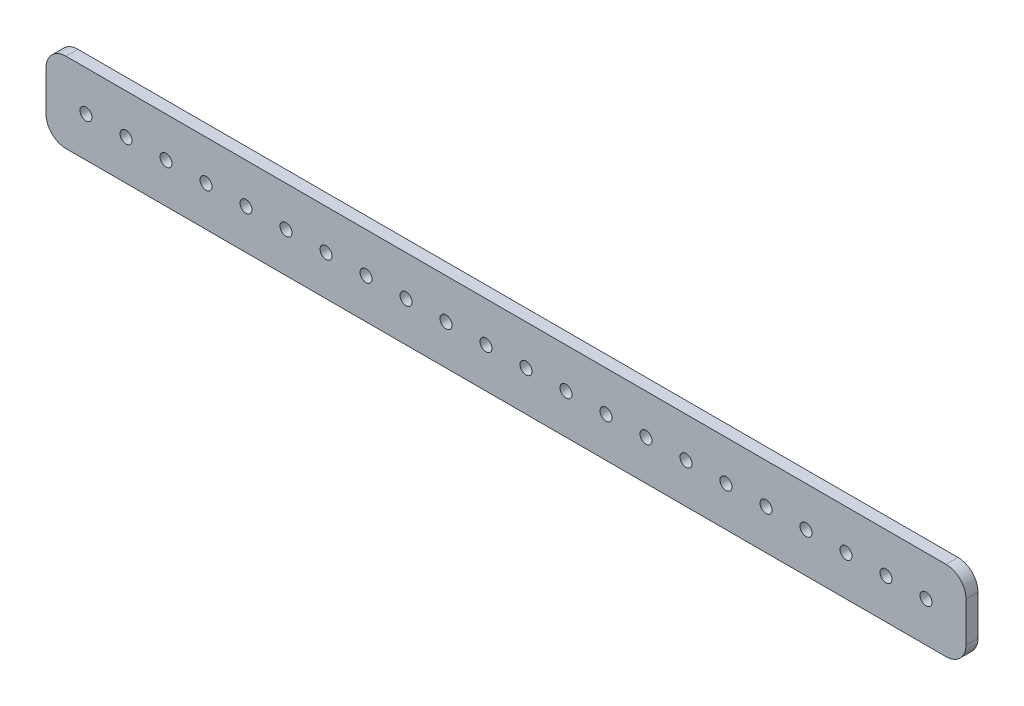
ISO-10303-21;
HEADER;
FILE_DESCRIPTION(('STEP AP214'),'2;1');
FILE_NAME('part.step','',(''),(''),'','','');
FILE_SCHEMA(('AUTOMOTIVE_DESIGN { 1 0 10303 214 1 1 1 1 }'));
ENDSEC;
DATA;
#1=APPLICATION_CONTEXT('core data for automotive mechanical design processes');
#2=APPLICATION_PROTOCOL_DEFINITION('international standard','automotive_design',2000,#1);
#3=PRODUCT_CONTEXT('',#1,'mechanical');
#4=PRODUCT('Part','Part','',(#3));
#5=PRODUCT_RELATED_PRODUCT_CATEGORY('part','',(#4));
#6=PRODUCT_DEFINITION_FORMATION('','',#4);
#7=PRODUCT_DEFINITION_CONTEXT('part definition',#1,'design');
#8=PRODUCT_DEFINITION('design','',#6,#7);
#9=PRODUCT_DEFINITION_SHAPE('','',#8);
#10=(LENGTH_UNIT() NAMED_UNIT(*) SI_UNIT(.MILLI.,.METRE.));
#11=(NAMED_UNIT(*) PLANE_ANGLE_UNIT() SI_UNIT($,.RADIAN.));
#12=(NAMED_UNIT(*) SI_UNIT($,.STERADIAN.) SOLID_ANGLE_UNIT());
#13=UNCERTAINTY_MEASURE_WITH_UNIT(LENGTH_MEASURE(1.E-05),#10,'distance_accuracy_value','');
#14=(GEOMETRIC_REPRESENTATION_CONTEXT(3) GLOBAL_UNCERTAINTY_ASSIGNED_CONTEXT((#13)) GLOBAL_UNIT_ASSIGNED_CONTEXT((#10,
#11,#12)) REPRESENTATION_CONTEXT('',''));
#15=CARTESIAN_POINT('',(0.,0.,0.));
#16=DIRECTION('',(0.,0.,1.));
#17=DIRECTION('',(1.,0.,0.));
#18=AXIS2_PLACEMENT_3D('',#15,#16,#17);
#19=CARTESIAN_POINT('',(110.,-5.,3.));
#20=DIRECTION('',(0.,0.,-1.));
#21=DIRECTION('',(-1.,0.,0.));
#22=AXIS2_PLACEMENT_3D('',#19,#20,#21);
#23=PLANE('',#22);
#24=CARTESIAN_POINT('',(110.,-5.,3.));
#25=DIRECTION('',(0.,0.,1.));
#26=DIRECTION('',(-1.,0.,0.));
#27=AXIS2_PLACEMENT_3D('',#24,#25,#26);
#28=CIRCLE('',#27,5.);
#29=CARTESIAN_POINT('',(110.,-10.,3.));
#30=VERTEX_POINT('',#29);
#31=CARTESIAN_POINT('',(115.,-5.,3.));
#32=VERTEX_POINT('',#31);
#33=EDGE_CURVE('E148',#30,#32,#28,.T.);
#34=ORIENTED_EDGE('',*,*,#33,.T.);
#35=DIRECTION('',(0.,1.,0.));
#36=VECTOR('',#35,1.);
#37=CARTESIAN_POINT('',(115.,5.,3.));
#38=LINE('',#37,#36);
#39=CARTESIAN_POINT('',(115.,5.,3.));
#40=VERTEX_POINT('',#39);
#41=EDGE_CURVE('E96',#32,#40,#38,.T.);
#42=ORIENTED_EDGE('',*,*,#41,.T.);
#43=CARTESIAN_POINT('',(110.,5.,3.));
#44=DIRECTION('',(0.,0.,1.));
#45=DIRECTION('',(1.,0.,0.));
#46=AXIS2_PLACEMENT_3D('',#43,#44,#45);
#47=CIRCLE('',#46,5.);
#48=CARTESIAN_POINT('',(110.,10.,3.));
#49=VERTEX_POINT('',#48);
#50=EDGE_CURVE('E163',#40,#49,#47,.T.);
#51=ORIENTED_EDGE('',*,*,#50,.T.);
#52=DIRECTION('',(-1.,0.,0.));
#53=VECTOR('',#52,1.);
#54=CARTESIAN_POINT('',(-110.,10.,3.));
#55=LINE('',#54,#53);
#56=CARTESIAN_POINT('',(-110.,10.,3.));
#57=VERTEX_POINT('',#56);
#58=EDGE_CURVE('E176',#49,#57,#55,.T.);
#59=ORIENTED_EDGE('',*,*,#58,.T.);
#60=CARTESIAN_POINT('',(-110.,5.,3.));
#61=DIRECTION('',(0.,0.,1.));
#62=DIRECTION('',(1.,0.,0.));
#63=AXIS2_PLACEMENT_3D('',#60,#61,#62);
#64=CIRCLE('',#63,5.);
#65=CARTESIAN_POINT('',(-115.,5.,3.));
#66=VERTEX_POINT('',#65);
#67=EDGE_CURVE('E115',#57,#66,#64,.T.);
#68=ORIENTED_EDGE('',*,*,#67,.T.);
#69=DIRECTION('',(0.,-1.,0.));
#70=VECTOR('',#69,1.);
#71=CARTESIAN_POINT('',(-115.,5.,3.));
#72=LINE('',#71,#70);
#73=CARTESIAN_POINT('',(-115.,-5.,3.));
#74=VERTEX_POINT('',#73);
#75=EDGE_CURVE('E109',#66,#74,#72,.T.);
#76=ORIENTED_EDGE('',*,*,#75,.T.);
#77=CARTESIAN_POINT('',(-110.,-5.,3.));
#78=DIRECTION('',(0.,0.,1.));
#79=DIRECTION('',(-1.,0.,0.));
#80=AXIS2_PLACEMENT_3D('',#77,#78,#79);
#81=CIRCLE('',#80,5.);
#82=CARTESIAN_POINT('',(-110.,-10.,3.));
#83=VERTEX_POINT('',#82);
#84=EDGE_CURVE('E113',#74,#83,#81,.T.);
#85=ORIENTED_EDGE('',*,*,#84,.T.);
#86=DIRECTION('',(1.,0.,0.));
#87=VECTOR('',#86,1.);
#88=CARTESIAN_POINT('',(-110.,-10.,3.));
#89=LINE('',#88,#87);
#90=EDGE_CURVE('E53',#83,#30,#89,.T.);
#91=ORIENTED_EDGE('',*,*,#90,.T.);
#92=EDGE_LOOP('',(#34,#42,#51,#59,#68,#76,#85,#91));
#93=FACE_BOUND('',#92,.T.);
#94=CARTESIAN_POINT('',(105.,0.,3.));
#95=DIRECTION('',(0.,0.,1.));
#96=DIRECTION('',(1.,0.,0.));
#97=AXIS2_PLACEMENT_3D('',#94,#95,#96);
#98=CIRCLE('',#97,1.50000000000003);
#99=CARTESIAN_POINT('',(106.5,0.,3.));
#100=VERTEX_POINT('',#99);
#101=EDGE_CURVE('E137',#100,#100,#98,.T.);
#102=ORIENTED_EDGE('',*,*,#101,.F.);
#103=EDGE_LOOP('',(#102));
#104=FACE_BOUND('',#103,.T.);
#105=CARTESIAN_POINT('',(-105.,0.,3.));
#106=DIRECTION('',(0.,0.,1.));
#107=DIRECTION('',(1.,0.,0.));
#108=AXIS2_PLACEMENT_3D('',#105,#106,#107);
#109=CIRCLE('',#108,1.50000000000003);
#110=CARTESIAN_POINT('',(-103.5,0.,3.));
#111=VERTEX_POINT('',#110);
#112=EDGE_CURVE('E185',#111,#111,#109,.T.);
#113=ORIENTED_EDGE('',*,*,#112,.F.);
#114=EDGE_LOOP('',(#113));
#115=FACE_BOUND('',#114,.T.);
#116=CARTESIAN_POINT('',(-95.,0.,3.));
#117=DIRECTION('',(0.,0.,1.));
#118=DIRECTION('',(1.,0.,0.));
#119=AXIS2_PLACEMENT_3D('',#116,#117,#118);
#120=CIRCLE('',#119,1.50000000000003);
#121=CARTESIAN_POINT('',(-93.5,0.,3.));
#122=VERTEX_POINT('',#121);
#123=EDGE_CURVE('E191',#122,#122,#120,.T.);
#124=ORIENTED_EDGE('',*,*,#123,.F.);
#125=EDGE_LOOP('',(#124));
#126=FACE_BOUND('',#125,.T.);
#127=CARTESIAN_POINT('',(-85.,0.,3.));
#128=DIRECTION('',(0.,0.,1.));
#129=DIRECTION('',(1.,0.,0.));
#130=AXIS2_PLACEMENT_3D('',#127,#128,#129);
#131=CIRCLE('',#130,1.5);
#132=CARTESIAN_POINT('',(-83.5,0.,3.));
#133=VERTEX_POINT('',#132);
#134=EDGE_CURVE('E197',#133,#133,#131,.T.);
#135=ORIENTED_EDGE('',*,*,#134,.F.);
#136=EDGE_LOOP('',(#135));
#137=FACE_BOUND('',#136,.T.);
#138=CARTESIAN_POINT('',(-75.,0.,3.));
#139=DIRECTION('',(0.,0.,1.));
#140=DIRECTION('',(1.,0.,0.));
#141=AXIS2_PLACEMENT_3D('',#138,#139,#140);
#142=CIRCLE('',#141,1.49999999999997);
#143=CARTESIAN_POINT('',(-73.5,0.,3.));
#144=VERTEX_POINT('',#143);
#145=EDGE_CURVE('E203',#144,#144,#142,.T.);
#146=ORIENTED_EDGE('',*,*,#145,.F.);
#147=EDGE_LOOP('',(#146));
#148=FACE_BOUND('',#147,.T.);
#149=CARTESIAN_POINT('',(-65.,0.,3.));
#150=DIRECTION('',(0.,0.,1.));
#151=DIRECTION('',(1.,0.,0.));
#152=AXIS2_PLACEMENT_3D('',#149,#150,#151);
#153=CIRCLE('',#152,1.5);
#154=CARTESIAN_POINT('',(-63.5,0.,3.));
#155=VERTEX_POINT('',#154);
#156=EDGE_CURVE('E209',#155,#155,#153,.T.);
#157=ORIENTED_EDGE('',*,*,#156,.F.);
#158=EDGE_LOOP('',(#157));
#159=FACE_BOUND('',#158,.T.);
#160=CARTESIAN_POINT('',(-55.,0.,3.));
#161=DIRECTION('',(0.,0.,1.));
#162=DIRECTION('',(1.,0.,0.));
#163=AXIS2_PLACEMENT_3D('',#160,#161,#162);
#164=CIRCLE('',#163,1.50000000000001);
#165=CARTESIAN_POINT('',(-53.5,0.,3.));
#166=VERTEX_POINT('',#165);
#167=EDGE_CURVE('E215',#166,#166,#164,.T.);
#168=ORIENTED_EDGE('',*,*,#167,.F.);
#169=EDGE_LOOP('',(#168));
#170=FACE_BOUND('',#169,.T.);
#171=CARTESIAN_POINT('',(-45.,0.,3.));
#172=DIRECTION('',(0.,0.,1.));
#173=DIRECTION('',(1.,0.,0.));
#174=AXIS2_PLACEMENT_3D('',#171,#172,#173);
#175=CIRCLE('',#174,1.5);
#176=CARTESIAN_POINT('',(-43.5,0.,3.));
#177=VERTEX_POINT('',#176);
#178=EDGE_CURVE('E221',#177,#177,#175,.T.);
#179=ORIENTED_EDGE('',*,*,#178,.F.);
#180=EDGE_LOOP('',(#179));
#181=FACE_BOUND('',#180,.T.);
#182=CARTESIAN_POINT('',(-35.,0.,3.));
#183=DIRECTION('',(0.,0.,1.));
#184=DIRECTION('',(1.,0.,0.));
#185=AXIS2_PLACEMENT_3D('',#182,#183,#184);
#186=CIRCLE('',#185,1.5);
#187=CARTESIAN_POINT('',(-33.5,0.,3.));
#188=VERTEX_POINT('',#187);
#189=EDGE_CURVE('E227',#188,#188,#186,.T.);
#190=ORIENTED_EDGE('',*,*,#189,.F.);
#191=EDGE_LOOP('',(#190));
#192=FACE_BOUND('',#191,.T.);
#193=CARTESIAN_POINT('',(-25.,0.,3.));
#194=DIRECTION('',(0.,0.,1.));
#195=DIRECTION('',(1.,0.,0.));
#196=AXIS2_PLACEMENT_3D('',#193,#194,#195);
#197=CIRCLE('',#196,1.5);
#198=CARTESIAN_POINT('',(-23.5,0.,3.));
#199=VERTEX_POINT('',#198);
#200=EDGE_CURVE('E233',#199,#199,#197,.T.);
#201=ORIENTED_EDGE('',*,*,#200,.F.);
#202=EDGE_LOOP('',(#201));
#203=FACE_BOUND('',#202,.T.);
#204=CARTESIAN_POINT('',(-15.,0.,3.));
#205=DIRECTION('',(0.,0.,1.));
#206=DIRECTION('',(1.,0.,0.));
#207=AXIS2_PLACEMENT_3D('',#204,#205,#206);
#208=CIRCLE('',#207,1.5);
#209=CARTESIAN_POINT('',(-13.5,0.,3.));
#210=VERTEX_POINT('',#209);
#211=EDGE_CURVE('E239',#210,#210,#208,.T.);
#212=ORIENTED_EDGE('',*,*,#211,.F.);
#213=EDGE_LOOP('',(#212));
#214=FACE_BOUND('',#213,.T.);
#215=CARTESIAN_POINT('',(-5.00000000000003,0.,3.));
#216=DIRECTION('',(0.,0.,1.));
#217=DIRECTION('',(1.,0.,0.));
#218=AXIS2_PLACEMENT_3D('',#215,#216,#217);
#219=CIRCLE('',#218,1.5);
#220=CARTESIAN_POINT('',(-3.50000000000003,0.,3.));
#221=VERTEX_POINT('',#220);
#222=EDGE_CURVE('E245',#221,#221,#219,.T.);
#223=ORIENTED_EDGE('',*,*,#222,.F.);
#224=EDGE_LOOP('',(#223));
#225=FACE_BOUND('',#224,.T.);
#226=CARTESIAN_POINT('',(25.,0.,3.));
#227=DIRECTION('',(0.,0.,1.));
#228=DIRECTION('',(1.,0.,0.));
#229=AXIS2_PLACEMENT_3D('',#226,#227,#228);
#230=CIRCLE('',#229,1.5);
#231=CARTESIAN_POINT('',(26.5,0.,3.));
#232=VERTEX_POINT('',#231);
#233=EDGE_CURVE('E251',#232,#232,#230,.T.);
#234=ORIENTED_EDGE('',*,*,#233,.F.);
#235=EDGE_LOOP('',(#234));
#236=FACE_BOUND('',#235,.T.);
#237=CARTESIAN_POINT('',(15.,0.,3.));
#238=DIRECTION('',(0.,0.,1.));
#239=DIRECTION('',(1.,0.,0.));
#240=AXIS2_PLACEMENT_3D('',#237,#238,#239);
#241=CIRCLE('',#240,1.5);
#242=CARTESIAN_POINT('',(16.5,0.,3.));
#243=VERTEX_POINT('',#242);
#244=EDGE_CURVE('E257',#243,#243,#241,.T.);
#245=ORIENTED_EDGE('',*,*,#244,.F.);
#246=EDGE_LOOP('',(#245));
#247=FACE_BOUND('',#246,.T.);
#248=CARTESIAN_POINT('',(4.99999999999996,0.,3.));
#249=DIRECTION('',(0.,0.,1.));
#250=DIRECTION('',(1.,0.,0.));
#251=AXIS2_PLACEMENT_3D('',#248,#249,#250);
#252=CIRCLE('',#251,1.5);
#253=CARTESIAN_POINT('',(6.49999999999996,0.,3.));
#254=VERTEX_POINT('',#253);
#255=EDGE_CURVE('E263',#254,#254,#252,.T.);
#256=ORIENTED_EDGE('',*,*,#255,.F.);
#257=EDGE_LOOP('',(#256));
#258=FACE_BOUND('',#257,.T.);
#259=CARTESIAN_POINT('',(35.,0.,3.));
#260=DIRECTION('',(0.,0.,1.));
#261=DIRECTION('',(1.,0.,0.));
#262=AXIS2_PLACEMENT_3D('',#259,#260,#261);
#263=CIRCLE('',#262,1.5);
#264=CARTESIAN_POINT('',(36.5,0.,3.));
#265=VERTEX_POINT('',#264);
#266=EDGE_CURVE('E269',#265,#265,#263,.T.);
#267=ORIENTED_EDGE('',*,*,#266,.F.);
#268=EDGE_LOOP('',(#267));
#269=FACE_BOUND('',#268,.T.);
#270=CARTESIAN_POINT('',(44.9999999999999,0.,3.));
#271=DIRECTION('',(0.,0.,1.));
#272=DIRECTION('',(1.,0.,0.));
#273=AXIS2_PLACEMENT_3D('',#270,#271,#272);
#274=CIRCLE('',#273,1.5);
#275=CARTESIAN_POINT('',(46.4999999999999,0.,3.));
#276=VERTEX_POINT('',#275);
#277=EDGE_CURVE('E275',#276,#276,#274,.T.);
#278=ORIENTED_EDGE('',*,*,#277,.F.);
#279=EDGE_LOOP('',(#278));
#280=FACE_BOUND('',#279,.T.);
#281=CARTESIAN_POINT('',(54.9999999999999,0.,3.));
#282=DIRECTION('',(0.,0.,1.));
#283=DIRECTION('',(1.,0.,0.));
#284=AXIS2_PLACEMENT_3D('',#281,#282,#283);
#285=CIRCLE('',#284,1.5);
#286=CARTESIAN_POINT('',(56.4999999999999,0.,3.));
#287=VERTEX_POINT('',#286);
#288=EDGE_CURVE('E281',#287,#287,#285,.T.);
#289=ORIENTED_EDGE('',*,*,#288,.F.);
#290=EDGE_LOOP('',(#289));
#291=FACE_BOUND('',#290,.T.);
#292=CARTESIAN_POINT('',(64.9999999999999,0.,3.));
#293=DIRECTION('',(0.,0.,1.));
#294=DIRECTION('',(1.,0.,0.));
#295=AXIS2_PLACEMENT_3D('',#292,#293,#294);
#296=CIRCLE('',#295,1.5);
#297=CARTESIAN_POINT('',(66.4999999999999,0.,3.));
#298=VERTEX_POINT('',#297);
#299=EDGE_CURVE('E287',#298,#298,#296,.T.);
#300=ORIENTED_EDGE('',*,*,#299,.F.);
#301=EDGE_LOOP('',(#300));
#302=FACE_BOUND('',#301,.T.);
#303=CARTESIAN_POINT('',(74.9999999999999,0.,3.));
#304=DIRECTION('',(0.,0.,1.));
#305=DIRECTION('',(1.,0.,0.));
#306=AXIS2_PLACEMENT_3D('',#303,#304,#305);
#307=CIRCLE('',#306,1.5);
#308=CARTESIAN_POINT('',(76.4999999999999,0.,3.));
#309=VERTEX_POINT('',#308);
#310=EDGE_CURVE('E293',#309,#309,#307,.T.);
#311=ORIENTED_EDGE('',*,*,#310,.F.);
#312=EDGE_LOOP('',(#311));
#313=FACE_BOUND('',#312,.T.);
#314=CARTESIAN_POINT('',(84.9999999999999,0.,3.));
#315=DIRECTION('',(0.,0.,1.));
#316=DIRECTION('',(1.,0.,0.));
#317=AXIS2_PLACEMENT_3D('',#314,#315,#316);
#318=CIRCLE('',#317,1.5);
#319=CARTESIAN_POINT('',(86.4999999999999,0.,3.));
#320=VERTEX_POINT('',#319);
#321=EDGE_CURVE('E299',#320,#320,#318,.T.);
#322=ORIENTED_EDGE('',*,*,#321,.F.);
#323=EDGE_LOOP('',(#322));
#324=FACE_BOUND('',#323,.T.);
#325=CARTESIAN_POINT('',(94.9999999999999,0.,3.));
#326=DIRECTION('',(0.,0.,1.));
#327=DIRECTION('',(1.,0.,0.));
#328=AXIS2_PLACEMENT_3D('',#325,#326,#327);
#329=CIRCLE('',#328,1.5);
#330=CARTESIAN_POINT('',(96.4999999999999,0.,3.));
#331=VERTEX_POINT('',#330);
#332=EDGE_CURVE('E305',#331,#331,#329,.T.);
#333=ORIENTED_EDGE('',*,*,#332,.F.);
#334=EDGE_LOOP('',(#333));
#335=FACE_BOUND('',#334,.T.);
#336=ADVANCED_FACE('F36',(#93,#104,#115,#126,#137,#148,#159,#170,#181,#192,#203,#214,#225,#236,
#247,#258,#269,#280,#291,#302,#313,#324,#335),#23,.F.);
#337=CARTESIAN_POINT('',(110.,-5.,0.));
#338=DIRECTION('',(0.,0.,-1.));
#339=DIRECTION('',(-1.,0.,0.));
#340=AXIS2_PLACEMENT_3D('',#337,#338,#339);
#341=PLANE('',#340);
#342=CARTESIAN_POINT('',(84.9999999999999,0.,0.));
#343=DIRECTION('',(0.,0.,1.));
#344=DIRECTION('',(1.,0.,0.));
#345=AXIS2_PLACEMENT_3D('',#342,#343,#344);
#346=CIRCLE('',#345,1.5);
#347=CARTESIAN_POINT('',(86.4999999999999,0.,0.));
#348=VERTEX_POINT('',#347);
#349=EDGE_CURVE('E302',#348,#348,#346,.T.);
#350=ORIENTED_EDGE('',*,*,#349,.T.);
#351=EDGE_LOOP('',(#350));
#352=FACE_BOUND('',#351,.T.);
#353=CARTESIAN_POINT('',(64.9999999999999,0.,0.));
#354=DIRECTION('',(0.,0.,1.));
#355=DIRECTION('',(1.,0.,0.));
#356=AXIS2_PLACEMENT_3D('',#353,#354,#355);
#357=CIRCLE('',#356,1.5);
#358=CARTESIAN_POINT('',(66.4999999999999,0.,0.));
#359=VERTEX_POINT('',#358);
#360=EDGE_CURVE('E290',#359,#359,#357,.T.);
#361=ORIENTED_EDGE('',*,*,#360,.T.);
#362=EDGE_LOOP('',(#361));
#363=FACE_BOUND('',#362,.T.);
#364=CARTESIAN_POINT('',(44.9999999999999,0.,0.));
#365=DIRECTION('',(0.,0.,1.));
#366=DIRECTION('',(1.,0.,0.));
#367=AXIS2_PLACEMENT_3D('',#364,#365,#366);
#368=CIRCLE('',#367,1.5);
#369=CARTESIAN_POINT('',(46.4999999999999,0.,0.));
#370=VERTEX_POINT('',#369);
#371=EDGE_CURVE('E278',#370,#370,#368,.T.);
#372=ORIENTED_EDGE('',*,*,#371,.T.);
#373=EDGE_LOOP('',(#372));
#374=FACE_BOUND('',#373,.T.);
#375=CARTESIAN_POINT('',(4.99999999999996,0.,0.));
#376=DIRECTION('',(0.,0.,1.));
#377=DIRECTION('',(1.,0.,0.));
#378=AXIS2_PLACEMENT_3D('',#375,#376,#377);
#379=CIRCLE('',#378,1.5);
#380=CARTESIAN_POINT('',(6.49999999999996,0.,0.));
#381=VERTEX_POINT('',#380);
#382=EDGE_CURVE('E266',#381,#381,#379,.T.);
#383=ORIENTED_EDGE('',*,*,#382,.T.);
#384=EDGE_LOOP('',(#383));
#385=FACE_BOUND('',#384,.T.);
#386=CARTESIAN_POINT('',(25.,0.,0.));
#387=DIRECTION('',(0.,0.,1.));
#388=DIRECTION('',(1.,0.,0.));
#389=AXIS2_PLACEMENT_3D('',#386,#387,#388);
#390=CIRCLE('',#389,1.5);
#391=CARTESIAN_POINT('',(26.5,0.,0.));
#392=VERTEX_POINT('',#391);
#393=EDGE_CURVE('E254',#392,#392,#390,.T.);
#394=ORIENTED_EDGE('',*,*,#393,.T.);
#395=EDGE_LOOP('',(#394));
#396=FACE_BOUND('',#395,.T.);
#397=CARTESIAN_POINT('',(-15.,0.,0.));
#398=DIRECTION('',(0.,0.,1.));
#399=DIRECTION('',(1.,0.,0.));
#400=AXIS2_PLACEMENT_3D('',#397,#398,#399);
#401=CIRCLE('',#400,1.5);
#402=CARTESIAN_POINT('',(-13.5,0.,0.));
#403=VERTEX_POINT('',#402);
#404=EDGE_CURVE('E242',#403,#403,#401,.T.);
#405=ORIENTED_EDGE('',*,*,#404,.T.);
#406=EDGE_LOOP('',(#405));
#407=FACE_BOUND('',#406,.T.);
#408=CARTESIAN_POINT('',(-35.,0.,0.));
#409=DIRECTION('',(0.,0.,1.));
#410=DIRECTION('',(1.,0.,0.));
#411=AXIS2_PLACEMENT_3D('',#408,#409,#410);
#412=CIRCLE('',#411,1.5);
#413=CARTESIAN_POINT('',(-33.5,0.,0.));
#414=VERTEX_POINT('',#413);
#415=EDGE_CURVE('E230',#414,#414,#412,.T.);
#416=ORIENTED_EDGE('',*,*,#415,.T.);
#417=EDGE_LOOP('',(#416));
#418=FACE_BOUND('',#417,.T.);
#419=CARTESIAN_POINT('',(-55.,0.,0.));
#420=DIRECTION('',(0.,0.,1.));
#421=DIRECTION('',(1.,0.,0.));
#422=AXIS2_PLACEMENT_3D('',#419,#420,#421);
#423=CIRCLE('',#422,1.50000000000001);
#424=CARTESIAN_POINT('',(-53.5,0.,0.));
#425=VERTEX_POINT('',#424);
#426=EDGE_CURVE('E218',#425,#425,#423,.T.);
#427=ORIENTED_EDGE('',*,*,#426,.T.);
#428=EDGE_LOOP('',(#427));
#429=FACE_BOUND('',#428,.T.);
#430=CARTESIAN_POINT('',(-75.,0.,0.));
#431=DIRECTION('',(0.,0.,1.));
#432=DIRECTION('',(1.,0.,0.));
#433=AXIS2_PLACEMENT_3D('',#430,#431,#432);
#434=CIRCLE('',#433,1.49999999999997);
#435=CARTESIAN_POINT('',(-73.5,0.,0.));
#436=VERTEX_POINT('',#435);
#437=EDGE_CURVE('E206',#436,#436,#434,.T.);
#438=ORIENTED_EDGE('',*,*,#437,.T.);
#439=EDGE_LOOP('',(#438));
#440=FACE_BOUND('',#439,.T.);
#441=CARTESIAN_POINT('',(-95.,0.,0.));
#442=DIRECTION('',(0.,0.,1.));
#443=DIRECTION('',(1.,0.,0.));
#444=AXIS2_PLACEMENT_3D('',#441,#442,#443);
#445=CIRCLE('',#444,1.50000000000003);
#446=CARTESIAN_POINT('',(-93.5,0.,0.));
#447=VERTEX_POINT('',#446);
#448=EDGE_CURVE('E194',#447,#447,#445,.T.);
#449=ORIENTED_EDGE('',*,*,#448,.T.);
#450=EDGE_LOOP('',(#449));
#451=FACE_BOUND('',#450,.T.);
#452=CARTESIAN_POINT('',(105.,0.,0.));
#453=DIRECTION('',(0.,0.,1.));
#454=DIRECTION('',(1.,0.,0.));
#455=AXIS2_PLACEMENT_3D('',#452,#453,#454);
#456=CIRCLE('',#455,1.50000000000003);
#457=CARTESIAN_POINT('',(106.5,0.,0.));
#458=VERTEX_POINT('',#457);
#459=EDGE_CURVE('E182',#458,#458,#456,.T.);
#460=ORIENTED_EDGE('',*,*,#459,.T.);
#461=EDGE_LOOP('',(#460));
#462=FACE_BOUND('',#461,.T.);
#463=CARTESIAN_POINT('',(110.,-5.,0.));
#464=DIRECTION('',(0.,0.,1.));
#465=DIRECTION('',(-1.,0.,0.));
#466=AXIS2_PLACEMENT_3D('',#463,#464,#465);
#467=CIRCLE('',#466,5.);
#468=CARTESIAN_POINT('',(110.,-10.,0.));
#469=VERTEX_POINT('',#468);
#470=CARTESIAN_POINT('',(115.,-5.,0.));
#471=VERTEX_POINT('',#470);
#472=EDGE_CURVE('E133',#469,#471,#467,.T.);
#473=ORIENTED_EDGE('',*,*,#472,.F.);
#474=DIRECTION('',(1.,0.,0.));
#475=VECTOR('',#474,1.);
#476=CARTESIAN_POINT('',(-110.,-10.,0.));
#477=LINE('',#476,#475);
#478=CARTESIAN_POINT('',(-110.,-10.,0.));
#479=VERTEX_POINT('',#478);
#480=EDGE_CURVE('E88',#479,#469,#477,.T.);
#481=ORIENTED_EDGE('',*,*,#480,.F.);
#482=CARTESIAN_POINT('',(-110.,-5.,0.));
#483=DIRECTION('',(0.,0.,1.));
#484=DIRECTION('',(-1.,0.,0.));
#485=AXIS2_PLACEMENT_3D('',#482,#483,#484);
#486=CIRCLE('',#485,5.);
#487=CARTESIAN_POINT('',(-115.,-5.,0.));
#488=VERTEX_POINT('',#487);
#489=EDGE_CURVE('E82',#488,#479,#486,.T.);
#490=ORIENTED_EDGE('',*,*,#489,.F.);
#491=DIRECTION('',(0.,-1.,0.));
#492=VECTOR('',#491,1.);
#493=CARTESIAN_POINT('',(-115.,5.,0.));
#494=LINE('',#493,#492);
#495=CARTESIAN_POINT('',(-115.,5.,0.));
#496=VERTEX_POINT('',#495);
#497=EDGE_CURVE('E123',#496,#488,#494,.T.);
#498=ORIENTED_EDGE('',*,*,#497,.F.);
#499=CARTESIAN_POINT('',(-110.,5.,0.));
#500=DIRECTION('',(0.,0.,1.));
#501=DIRECTION('',(1.,0.,0.));
#502=AXIS2_PLACEMENT_3D('',#499,#500,#501);
#503=CIRCLE('',#502,5.);
#504=CARTESIAN_POINT('',(-110.,10.,0.));
#505=VERTEX_POINT('',#504);
#506=EDGE_CURVE('E143',#505,#496,#503,.T.);
#507=ORIENTED_EDGE('',*,*,#506,.F.);
#508=DIRECTION('',(-1.,0.,0.));
#509=VECTOR('',#508,1.);
#510=CARTESIAN_POINT('',(-110.,10.,0.));
#511=LINE('',#510,#509);
#512=CARTESIAN_POINT('',(110.,10.,0.));
#513=VERTEX_POINT('',#512);
#514=EDGE_CURVE('E141',#513,#505,#511,.T.);
#515=ORIENTED_EDGE('',*,*,#514,.F.);
#516=CARTESIAN_POINT('',(110.,5.,0.));
#517=DIRECTION('',(0.,0.,1.));
#518=DIRECTION('',(1.,0.,0.));
#519=AXIS2_PLACEMENT_3D('',#516,#517,#518);
#520=CIRCLE('',#519,5.);
#521=CARTESIAN_POINT('',(115.,5.,0.));
#522=VERTEX_POINT('',#521);
#523=EDGE_CURVE('E139',#522,#513,#520,.T.);
#524=ORIENTED_EDGE('',*,*,#523,.F.);
#525=DIRECTION('',(0.,1.,0.));
#526=VECTOR('',#525,1.);
#527=CARTESIAN_POINT('',(115.,5.,0.));
#528=LINE('',#527,#526);
#529=EDGE_CURVE('E136',#471,#522,#528,.T.);
#530=ORIENTED_EDGE('',*,*,#529,.F.);
#531=EDGE_LOOP('',(#473,#481,#490,#498,#507,#515,#524,#530));
#532=FACE_BOUND('',#531,.T.);
#533=CARTESIAN_POINT('',(-105.,0.,0.));
#534=DIRECTION('',(0.,0.,1.));
#535=DIRECTION('',(1.,0.,0.));
#536=AXIS2_PLACEMENT_3D('',#533,#534,#535);
#537=CIRCLE('',#536,1.50000000000003);
#538=CARTESIAN_POINT('',(-103.5,0.,0.));
#539=VERTEX_POINT('',#538);
#540=EDGE_CURVE('E188',#539,#539,#537,.T.);
#541=ORIENTED_EDGE('',*,*,#540,.T.);
#542=EDGE_LOOP('',(#541));
#543=FACE_BOUND('',#542,.T.);
#544=CARTESIAN_POINT('',(-85.,0.,0.));
#545=DIRECTION('',(0.,0.,1.));
#546=DIRECTION('',(1.,0.,0.));
#547=AXIS2_PLACEMENT_3D('',#544,#545,#546);
#548=CIRCLE('',#547,1.5);
#549=CARTESIAN_POINT('',(-83.5,0.,0.));
#550=VERTEX_POINT('',#549);
#551=EDGE_CURVE('E200',#550,#550,#548,.T.);
#552=ORIENTED_EDGE('',*,*,#551,.T.);
#553=EDGE_LOOP('',(#552));
#554=FACE_BOUND('',#553,.T.);
#555=CARTESIAN_POINT('',(-65.,0.,0.));
#556=DIRECTION('',(0.,0.,1.));
#557=DIRECTION('',(1.,0.,0.));
#558=AXIS2_PLACEMENT_3D('',#555,#556,#557);
#559=CIRCLE('',#558,1.5);
#560=CARTESIAN_POINT('',(-63.5,0.,0.));
#561=VERTEX_POINT('',#560);
#562=EDGE_CURVE('E212',#561,#561,#559,.T.);
#563=ORIENTED_EDGE('',*,*,#562,.T.);
#564=EDGE_LOOP('',(#563));
#565=FACE_BOUND('',#564,.T.);
#566=CARTESIAN_POINT('',(-45.,0.,0.));
#567=DIRECTION('',(0.,0.,1.));
#568=DIRECTION('',(1.,0.,0.));
#569=AXIS2_PLACEMENT_3D('',#566,#567,#568);
#570=CIRCLE('',#569,1.5);
#571=CARTESIAN_POINT('',(-43.5,0.,0.));
#572=VERTEX_POINT('',#571);
#573=EDGE_CURVE('E224',#572,#572,#570,.T.);
#574=ORIENTED_EDGE('',*,*,#573,.T.);
#575=EDGE_LOOP('',(#574));
#576=FACE_BOUND('',#575,.T.);
#577=CARTESIAN_POINT('',(-25.,0.,0.));
#578=DIRECTION('',(0.,0.,1.));
#579=DIRECTION('',(1.,0.,0.));
#580=AXIS2_PLACEMENT_3D('',#577,#578,#579);
#581=CIRCLE('',#580,1.5);
#582=CARTESIAN_POINT('',(-23.5,0.,0.));
#583=VERTEX_POINT('',#582);
#584=EDGE_CURVE('E236',#583,#583,#581,.T.);
#585=ORIENTED_EDGE('',*,*,#584,.T.);
#586=EDGE_LOOP('',(#585));
#587=FACE_BOUND('',#586,.T.);
#588=CARTESIAN_POINT('',(-5.00000000000003,0.,0.));
#589=DIRECTION('',(0.,0.,1.));
#590=DIRECTION('',(1.,0.,0.));
#591=AXIS2_PLACEMENT_3D('',#588,#589,#590);
#592=CIRCLE('',#591,1.5);
#593=CARTESIAN_POINT('',(-3.50000000000003,0.,0.));
#594=VERTEX_POINT('',#593);
#595=EDGE_CURVE('E248',#594,#594,#592,.T.);
#596=ORIENTED_EDGE('',*,*,#595,.T.);
#597=EDGE_LOOP('',(#596));
#598=FACE_BOUND('',#597,.T.);
#599=CARTESIAN_POINT('',(15.,0.,0.));
#600=DIRECTION('',(0.,0.,1.));
#601=DIRECTION('',(1.,0.,0.));
#602=AXIS2_PLACEMENT_3D('',#599,#600,#601);
#603=CIRCLE('',#602,1.5);
#604=CARTESIAN_POINT('',(16.5,0.,0.));
#605=VERTEX_POINT('',#604);
#606=EDGE_CURVE('E260',#605,#605,#603,.T.);
#607=ORIENTED_EDGE('',*,*,#606,.T.);
#608=EDGE_LOOP('',(#607));
#609=FACE_BOUND('',#608,.T.);
#610=CARTESIAN_POINT('',(35.,0.,0.));
#611=DIRECTION('',(0.,0.,1.));
#612=DIRECTION('',(1.,0.,0.));
#613=AXIS2_PLACEMENT_3D('',#610,#611,#612);
#614=CIRCLE('',#613,1.5);
#615=CARTESIAN_POINT('',(36.5,0.,0.));
#616=VERTEX_POINT('',#615);
#617=EDGE_CURVE('E272',#616,#616,#614,.T.);
#618=ORIENTED_EDGE('',*,*,#617,.T.);
#619=EDGE_LOOP('',(#618));
#620=FACE_BOUND('',#619,.T.);
#621=CARTESIAN_POINT('',(54.9999999999999,0.,0.));
#622=DIRECTION('',(0.,0.,1.));
#623=DIRECTION('',(1.,0.,0.));
#624=AXIS2_PLACEMENT_3D('',#621,#622,#623);
#625=CIRCLE('',#624,1.5);
#626=CARTESIAN_POINT('',(56.4999999999999,0.,0.));
#627=VERTEX_POINT('',#626);
#628=EDGE_CURVE('E284',#627,#627,#625,.T.);
#629=ORIENTED_EDGE('',*,*,#628,.T.);
#630=EDGE_LOOP('',(#629));
#631=FACE_BOUND('',#630,.T.);
#632=CARTESIAN_POINT('',(74.9999999999999,0.,0.));
#633=DIRECTION('',(0.,0.,1.));
#634=DIRECTION('',(1.,0.,0.));
#635=AXIS2_PLACEMENT_3D('',#632,#633,#634);
#636=CIRCLE('',#635,1.5);
#637=CARTESIAN_POINT('',(76.4999999999999,0.,0.));
#638=VERTEX_POINT('',#637);
#639=EDGE_CURVE('E296',#638,#638,#636,.T.);
#640=ORIENTED_EDGE('',*,*,#639,.T.);
#641=EDGE_LOOP('',(#640));
#642=FACE_BOUND('',#641,.T.);
#643=CARTESIAN_POINT('',(94.9999999999999,0.,0.));
#644=DIRECTION('',(0.,0.,1.));
#645=DIRECTION('',(1.,0.,0.));
#646=AXIS2_PLACEMENT_3D('',#643,#644,#645);
#647=CIRCLE('',#646,1.5);
#648=CARTESIAN_POINT('',(96.4999999999999,0.,0.));
#649=VERTEX_POINT('',#648);
#650=EDGE_CURVE('E308',#649,#649,#647,.T.);
#651=ORIENTED_EDGE('',*,*,#650,.T.);
#652=EDGE_LOOP('',(#651));
#653=FACE_BOUND('',#652,.T.);
#654=ADVANCED_FACE('F167',(#352,#363,#374,#385,#396,#407,#418,#429,#440,#451,#462,#532,#543,
#554,#565,#576,#587,#598,#609,#620,#631,#642,#653),#341,.T.);
#655=CARTESIAN_POINT('',(110.,-5.,3.));
#656=DIRECTION('',(0.,0.,-1.));
#657=DIRECTION('',(-1.,0.,0.));
#658=AXIS2_PLACEMENT_3D('',#655,#656,#657);
#659=CYLINDRICAL_SURFACE('',#658,5.);
#660=ORIENTED_EDGE('',*,*,#472,.T.);
#661=DIRECTION('',(0.,0.,-1.));
#662=VECTOR('',#661,1.);
#663=CARTESIAN_POINT('',(115.,-5.,3.));
#664=LINE('',#663,#662);
#665=EDGE_CURVE('E11',#32,#471,#664,.T.);
#666=ORIENTED_EDGE('',*,*,#665,.F.);
#667=ORIENTED_EDGE('',*,*,#33,.F.);
#668=DIRECTION('',(0.,0.,-1.));
#669=VECTOR('',#668,1.);
#670=CARTESIAN_POINT('',(110.,-10.,3.));
#671=LINE('',#670,#669);
#672=EDGE_CURVE('E129',#30,#469,#671,.T.);
#673=ORIENTED_EDGE('',*,*,#672,.T.);
#674=EDGE_LOOP('',(#660,#666,#667,#673));
#675=FACE_BOUND('',#674,.T.);
#676=ADVANCED_FACE('F38',(#675),#659,.T.);
#677=CARTESIAN_POINT('',(115.,5.,3.));
#678=DIRECTION('',(-1.,0.,0.));
#679=DIRECTION('',(0.,0.,1.));
#680=AXIS2_PLACEMENT_3D('',#677,#678,#679);
#681=PLANE('',#680);
#682=ORIENTED_EDGE('',*,*,#529,.T.);
#683=DIRECTION('',(0.,0.,-1.));
#684=VECTOR('',#683,1.);
#685=CARTESIAN_POINT('',(115.,5.,3.));
#686=LINE('',#685,#684);
#687=EDGE_CURVE('E45',#40,#522,#686,.T.);
#688=ORIENTED_EDGE('',*,*,#687,.F.);
#689=ORIENTED_EDGE('',*,*,#41,.F.);
#690=ORIENTED_EDGE('',*,*,#665,.T.);
#691=EDGE_LOOP('',(#682,#688,#689,#690));
#692=FACE_BOUND('',#691,.T.);
#693=ADVANCED_FACE('F340',(#692),#681,.F.);
#694=CARTESIAN_POINT('',(110.,5.,3.));
#695=DIRECTION('',(0.,0.,-1.));
#696=DIRECTION('',(-1.,0.,0.));
#697=AXIS2_PLACEMENT_3D('',#694,#695,#696);
#698=CYLINDRICAL_SURFACE('',#697,5.);
#699=ORIENTED_EDGE('',*,*,#523,.T.);
#700=DIRECTION('',(0.,0.,-1.));
#701=VECTOR('',#700,1.);
#702=CARTESIAN_POINT('',(110.,10.,3.));
#703=LINE('',#702,#701);
#704=EDGE_CURVE('E155',#49,#513,#703,.T.);
#705=ORIENTED_EDGE('',*,*,#704,.F.);
#706=ORIENTED_EDGE('',*,*,#50,.F.);
#707=ORIENTED_EDGE('',*,*,#687,.T.);
#708=EDGE_LOOP('',(#699,#705,#706,#707));
#709=FACE_BOUND('',#708,.T.);
#710=ADVANCED_FACE('F161',(#709),#698,.T.);
#711=CARTESIAN_POINT('',(-110.,10.,3.));
#712=DIRECTION('',(0.,-1.,0.));
#713=DIRECTION('',(0.,0.,-1.));
#714=AXIS2_PLACEMENT_3D('',#711,#712,#713);
#715=PLANE('',#714);
#716=ORIENTED_EDGE('',*,*,#514,.T.);
#717=DIRECTION('',(0.,0.,-1.));
#718=VECTOR('',#717,1.);
#719=CARTESIAN_POINT('',(-110.,10.,3.));
#720=LINE('',#719,#718);
#721=EDGE_CURVE('E152',#57,#505,#720,.T.);
#722=ORIENTED_EDGE('',*,*,#721,.F.);
#723=ORIENTED_EDGE('',*,*,#58,.F.);
#724=ORIENTED_EDGE('',*,*,#704,.T.);
#725=EDGE_LOOP('',(#716,#722,#723,#724));
#726=FACE_BOUND('',#725,.T.);
#727=ADVANCED_FACE('F172',(#726),#715,.F.);
#728=CARTESIAN_POINT('',(-110.,5.,3.));
#729=DIRECTION('',(0.,0.,-1.));
#730=DIRECTION('',(-1.,0.,0.));
#731=AXIS2_PLACEMENT_3D('',#728,#729,#730);
#732=CYLINDRICAL_SURFACE('',#731,5.);
#733=ORIENTED_EDGE('',*,*,#506,.T.);
#734=DIRECTION('',(0.,0.,-1.));
#735=VECTOR('',#734,1.);
#736=CARTESIAN_POINT('',(-115.,5.,3.));
#737=LINE('',#736,#735);
#738=EDGE_CURVE('E124',#66,#496,#737,.T.);
#739=ORIENTED_EDGE('',*,*,#738,.F.);
#740=ORIENTED_EDGE('',*,*,#67,.F.);
#741=ORIENTED_EDGE('',*,*,#721,.T.);
#742=EDGE_LOOP('',(#733,#739,#740,#741));
#743=FACE_BOUND('',#742,.T.);
#744=ADVANCED_FACE('F175',(#743),#732,.T.);
#745=CARTESIAN_POINT('',(-115.,5.,3.));
#746=DIRECTION('',(1.,0.,0.));
#747=DIRECTION('',(0.,0.,-1.));
#748=AXIS2_PLACEMENT_3D('',#745,#746,#747);
#749=PLANE('',#748);
#750=ORIENTED_EDGE('',*,*,#497,.T.);
#751=DIRECTION('',(0.,0.,-1.));
#752=VECTOR('',#751,1.);
#753=CARTESIAN_POINT('',(-115.,-5.,3.));
#754=LINE('',#753,#752);
#755=EDGE_CURVE('E120',#74,#488,#754,.T.);
#756=ORIENTED_EDGE('',*,*,#755,.F.);
#757=ORIENTED_EDGE('',*,*,#75,.F.);
#758=ORIENTED_EDGE('',*,*,#738,.T.);
#759=EDGE_LOOP('',(#750,#756,#757,#758));
#760=FACE_BOUND('',#759,.T.);
#761=ADVANCED_FACE('F121',(#760),#749,.F.);
#762=CARTESIAN_POINT('',(-110.,-5.,3.));
#763=DIRECTION('',(0.,0.,-1.));
#764=DIRECTION('',(-1.,0.,0.));
#765=AXIS2_PLACEMENT_3D('',#762,#763,#764);
#766=CYLINDRICAL_SURFACE('',#765,5.);
#767=ORIENTED_EDGE('',*,*,#489,.T.);
#768=DIRECTION('',(0.,0.,-1.));
#769=VECTOR('',#768,1.);
#770=CARTESIAN_POINT('',(-110.,-10.,3.));
#771=LINE('',#770,#769);
#772=EDGE_CURVE('E125',#83,#479,#771,.T.);
#773=ORIENTED_EDGE('',*,*,#772,.F.);
#774=ORIENTED_EDGE('',*,*,#84,.F.);
#775=ORIENTED_EDGE('',*,*,#755,.T.);
#776=EDGE_LOOP('',(#767,#773,#774,#775));
#777=FACE_BOUND('',#776,.T.);
#778=ADVANCED_FACE('F127',(#777),#766,.T.);
#779=CARTESIAN_POINT('',(-110.,-10.,3.));
#780=DIRECTION('',(0.,1.,0.));
#781=DIRECTION('',(0.,0.,1.));
#782=AXIS2_PLACEMENT_3D('',#779,#780,#781);
#783=PLANE('',#782);
#784=ORIENTED_EDGE('',*,*,#480,.T.);
#785=ORIENTED_EDGE('',*,*,#672,.F.);
#786=ORIENTED_EDGE('',*,*,#90,.F.);
#787=ORIENTED_EDGE('',*,*,#772,.T.);
#788=EDGE_LOOP('',(#784,#785,#786,#787));
#789=FACE_BOUND('',#788,.T.);
#790=ADVANCED_FACE('F328',(#789),#783,.F.);
#791=CARTESIAN_POINT('',(105.,0.,3.));
#792=DIRECTION('',(0.,0.,-1.));
#793=DIRECTION('',(-1.,0.,0.));
#794=AXIS2_PLACEMENT_3D('',#791,#792,#793);
#795=CYLINDRICAL_SURFACE('',#794,1.50000000000003);
#796=ORIENTED_EDGE('',*,*,#101,.T.);
#797=EDGE_LOOP('',(#796));
#798=FACE_BOUND('',#797,.T.);
#799=ORIENTED_EDGE('',*,*,#459,.F.);
#800=EDGE_LOOP('',(#799));
#801=FACE_BOUND('',#800,.T.);
#802=ADVANCED_FACE('F325',(#798,#801),#795,.F.);
#803=CARTESIAN_POINT('',(-105.,0.,3.));
#804=DIRECTION('',(0.,0.,-1.));
#805=DIRECTION('',(-1.,0.,0.));
#806=AXIS2_PLACEMENT_3D('',#803,#804,#805);
#807=CYLINDRICAL_SURFACE('',#806,1.50000000000003);
#808=ORIENTED_EDGE('',*,*,#112,.T.);
#809=EDGE_LOOP('',(#808));
#810=FACE_BOUND('',#809,.T.);
#811=ORIENTED_EDGE('',*,*,#540,.F.);
#812=EDGE_LOOP('',(#811));
#813=FACE_BOUND('',#812,.T.);
#814=ADVANCED_FACE('F404',(#810,#813),#807,.F.);
#815=CARTESIAN_POINT('',(-95.,0.,3.));
#816=DIRECTION('',(0.,0.,-1.));
#817=DIRECTION('',(-1.,0.,0.));
#818=AXIS2_PLACEMENT_3D('',#815,#816,#817);
#819=CYLINDRICAL_SURFACE('',#818,1.50000000000003);
#820=ORIENTED_EDGE('',*,*,#123,.T.);
#821=EDGE_LOOP('',(#820));
#822=FACE_BOUND('',#821,.T.);
#823=ORIENTED_EDGE('',*,*,#448,.F.);
#824=EDGE_LOOP('',(#823));
#825=FACE_BOUND('',#824,.T.);
#826=ADVANCED_FACE('F412',(#822,#825),#819,.F.);
#827=CARTESIAN_POINT('',(-85.,0.,3.));
#828=DIRECTION('',(0.,0.,-1.));
#829=DIRECTION('',(-1.,0.,0.));
#830=AXIS2_PLACEMENT_3D('',#827,#828,#829);
#831=CYLINDRICAL_SURFACE('',#830,1.5);
#832=ORIENTED_EDGE('',*,*,#134,.T.);
#833=EDGE_LOOP('',(#832));
#834=FACE_BOUND('',#833,.T.);
#835=ORIENTED_EDGE('',*,*,#551,.F.);
#836=EDGE_LOOP('',(#835));
#837=FACE_BOUND('',#836,.T.);
#838=ADVANCED_FACE('F420',(#834,#837),#831,.F.);
#839=CARTESIAN_POINT('',(-75.,0.,3.));
#840=DIRECTION('',(0.,0.,-1.));
#841=DIRECTION('',(-1.,0.,0.));
#842=AXIS2_PLACEMENT_3D('',#839,#840,#841);
#843=CYLINDRICAL_SURFACE('',#842,1.49999999999997);
#844=ORIENTED_EDGE('',*,*,#145,.T.);
#845=EDGE_LOOP('',(#844));
#846=FACE_BOUND('',#845,.T.);
#847=ORIENTED_EDGE('',*,*,#437,.F.);
#848=EDGE_LOOP('',(#847));
#849=FACE_BOUND('',#848,.T.);
#850=ADVANCED_FACE('F429',(#846,#849),#843,.F.);
#851=CARTESIAN_POINT('',(-65.,0.,3.));
#852=DIRECTION('',(0.,0.,-1.));
#853=DIRECTION('',(-1.,0.,0.));
#854=AXIS2_PLACEMENT_3D('',#851,#852,#853);
#855=CYLINDRICAL_SURFACE('',#854,1.5);
#856=ORIENTED_EDGE('',*,*,#156,.T.);
#857=EDGE_LOOP('',(#856));
#858=FACE_BOUND('',#857,.T.);
#859=ORIENTED_EDGE('',*,*,#562,.F.);
#860=EDGE_LOOP('',(#859));
#861=FACE_BOUND('',#860,.T.);
#862=ADVANCED_FACE('F438',(#858,#861),#855,.F.);
#863=CARTESIAN_POINT('',(-55.,0.,3.));
#864=DIRECTION('',(0.,0.,-1.));
#865=DIRECTION('',(-1.,0.,0.));
#866=AXIS2_PLACEMENT_3D('',#863,#864,#865);
#867=CYLINDRICAL_SURFACE('',#866,1.50000000000001);
#868=ORIENTED_EDGE('',*,*,#167,.T.);
#869=EDGE_LOOP('',(#868));
#870=FACE_BOUND('',#869,.T.);
#871=ORIENTED_EDGE('',*,*,#426,.F.);
#872=EDGE_LOOP('',(#871));
#873=FACE_BOUND('',#872,.T.);
#874=ADVANCED_FACE('F447',(#870,#873),#867,.F.);
#875=CARTESIAN_POINT('',(-45.,0.,3.));
#876=DIRECTION('',(0.,0.,-1.));
#877=DIRECTION('',(-1.,0.,0.));
#878=AXIS2_PLACEMENT_3D('',#875,#876,#877);
#879=CYLINDRICAL_SURFACE('',#878,1.5);
#880=ORIENTED_EDGE('',*,*,#178,.T.);
#881=EDGE_LOOP('',(#880));
#882=FACE_BOUND('',#881,.T.);
#883=ORIENTED_EDGE('',*,*,#573,.F.);
#884=EDGE_LOOP('',(#883));
#885=FACE_BOUND('',#884,.T.);
#886=ADVANCED_FACE('F456',(#882,#885),#879,.F.);
#887=CARTESIAN_POINT('',(-35.,0.,3.));
#888=DIRECTION('',(0.,0.,-1.));
#889=DIRECTION('',(-1.,0.,0.));
#890=AXIS2_PLACEMENT_3D('',#887,#888,#889);
#891=CYLINDRICAL_SURFACE('',#890,1.5);
#892=ORIENTED_EDGE('',*,*,#189,.T.);
#893=EDGE_LOOP('',(#892));
#894=FACE_BOUND('',#893,.T.);
#895=ORIENTED_EDGE('',*,*,#415,.F.);
#896=EDGE_LOOP('',(#895));
#897=FACE_BOUND('',#896,.T.);
#898=ADVANCED_FACE('F465',(#894,#897),#891,.F.);
#899=CARTESIAN_POINT('',(-25.,0.,3.));
#900=DIRECTION('',(0.,0.,-1.));
#901=DIRECTION('',(-1.,0.,0.));
#902=AXIS2_PLACEMENT_3D('',#899,#900,#901);
#903=CYLINDRICAL_SURFACE('',#902,1.5);
#904=ORIENTED_EDGE('',*,*,#200,.T.);
#905=EDGE_LOOP('',(#904));
#906=FACE_BOUND('',#905,.T.);
#907=ORIENTED_EDGE('',*,*,#584,.F.);
#908=EDGE_LOOP('',(#907));
#909=FACE_BOUND('',#908,.T.);
#910=ADVANCED_FACE('F474',(#906,#909),#903,.F.);
#911=CARTESIAN_POINT('',(-15.,0.,3.));
#912=DIRECTION('',(0.,0.,-1.));
#913=DIRECTION('',(-1.,0.,0.));
#914=AXIS2_PLACEMENT_3D('',#911,#912,#913);
#915=CYLINDRICAL_SURFACE('',#914,1.5);
#916=ORIENTED_EDGE('',*,*,#211,.T.);
#917=EDGE_LOOP('',(#916));
#918=FACE_BOUND('',#917,.T.);
#919=ORIENTED_EDGE('',*,*,#404,.F.);
#920=EDGE_LOOP('',(#919));
#921=FACE_BOUND('',#920,.T.);
#922=ADVANCED_FACE('F483',(#918,#921),#915,.F.);
#923=CARTESIAN_POINT('',(-5.00000000000003,0.,3.));
#924=DIRECTION('',(0.,0.,-1.));
#925=DIRECTION('',(-1.,0.,0.));
#926=AXIS2_PLACEMENT_3D('',#923,#924,#925);
#927=CYLINDRICAL_SURFACE('',#926,1.5);
#928=ORIENTED_EDGE('',*,*,#222,.T.);
#929=EDGE_LOOP('',(#928));
#930=FACE_BOUND('',#929,.T.);
#931=ORIENTED_EDGE('',*,*,#595,.F.);
#932=EDGE_LOOP('',(#931));
#933=FACE_BOUND('',#932,.T.);
#934=ADVANCED_FACE('F492',(#930,#933),#927,.F.);
#935=CARTESIAN_POINT('',(25.,0.,3.));
#936=DIRECTION('',(0.,0.,-1.));
#937=DIRECTION('',(-1.,0.,0.));
#938=AXIS2_PLACEMENT_3D('',#935,#936,#937);
#939=CYLINDRICAL_SURFACE('',#938,1.5);
#940=ORIENTED_EDGE('',*,*,#233,.T.);
#941=EDGE_LOOP('',(#940));
#942=FACE_BOUND('',#941,.T.);
#943=ORIENTED_EDGE('',*,*,#393,.F.);
#944=EDGE_LOOP('',(#943));
#945=FACE_BOUND('',#944,.T.);
#946=ADVANCED_FACE('F501',(#942,#945),#939,.F.);
#947=CARTESIAN_POINT('',(15.,0.,3.));
#948=DIRECTION('',(0.,0.,-1.));
#949=DIRECTION('',(-1.,0.,0.));
#950=AXIS2_PLACEMENT_3D('',#947,#948,#949);
#951=CYLINDRICAL_SURFACE('',#950,1.5);
#952=ORIENTED_EDGE('',*,*,#244,.T.);
#953=EDGE_LOOP('',(#952));
#954=FACE_BOUND('',#953,.T.);
#955=ORIENTED_EDGE('',*,*,#606,.F.);
#956=EDGE_LOOP('',(#955));
#957=FACE_BOUND('',#956,.T.);
#958=ADVANCED_FACE('F510',(#954,#957),#951,.F.);
#959=CARTESIAN_POINT('',(4.99999999999996,0.,3.));
#960=DIRECTION('',(0.,0.,-1.));
#961=DIRECTION('',(-1.,0.,0.));
#962=AXIS2_PLACEMENT_3D('',#959,#960,#961);
#963=CYLINDRICAL_SURFACE('',#962,1.5);
#964=ORIENTED_EDGE('',*,*,#255,.T.);
#965=EDGE_LOOP('',(#964));
#966=FACE_BOUND('',#965,.T.);
#967=ORIENTED_EDGE('',*,*,#382,.F.);
#968=EDGE_LOOP('',(#967));
#969=FACE_BOUND('',#968,.T.);
#970=ADVANCED_FACE('F519',(#966,#969),#963,.F.);
#971=CARTESIAN_POINT('',(35.,0.,3.));
#972=DIRECTION('',(0.,0.,-1.));
#973=DIRECTION('',(-1.,0.,0.));
#974=AXIS2_PLACEMENT_3D('',#971,#972,#973);
#975=CYLINDRICAL_SURFACE('',#974,1.5);
#976=ORIENTED_EDGE('',*,*,#266,.T.);
#977=EDGE_LOOP('',(#976));
#978=FACE_BOUND('',#977,.T.);
#979=ORIENTED_EDGE('',*,*,#617,.F.);
#980=EDGE_LOOP('',(#979));
#981=FACE_BOUND('',#980,.T.);
#982=ADVANCED_FACE('F528',(#978,#981),#975,.F.);
#983=CARTESIAN_POINT('',(44.9999999999999,0.,3.));
#984=DIRECTION('',(0.,0.,-1.));
#985=DIRECTION('',(-1.,0.,0.));
#986=AXIS2_PLACEMENT_3D('',#983,#984,#985);
#987=CYLINDRICAL_SURFACE('',#986,1.5);
#988=ORIENTED_EDGE('',*,*,#277,.T.);
#989=EDGE_LOOP('',(#988));
#990=FACE_BOUND('',#989,.T.);
#991=ORIENTED_EDGE('',*,*,#371,.F.);
#992=EDGE_LOOP('',(#991));
#993=FACE_BOUND('',#992,.T.);
#994=ADVANCED_FACE('F537',(#990,#993),#987,.F.);
#995=CARTESIAN_POINT('',(54.9999999999999,0.,3.));
#996=DIRECTION('',(0.,0.,-1.));
#997=DIRECTION('',(-1.,0.,0.));
#998=AXIS2_PLACEMENT_3D('',#995,#996,#997);
#999=CYLINDRICAL_SURFACE('',#998,1.5);
#1000=ORIENTED_EDGE('',*,*,#288,.T.);
#1001=EDGE_LOOP('',(#1000));
#1002=FACE_BOUND('',#1001,.T.);
#1003=ORIENTED_EDGE('',*,*,#628,.F.);
#1004=EDGE_LOOP('',(#1003));
#1005=FACE_BOUND('',#1004,.T.);
#1006=ADVANCED_FACE('F546',(#1002,#1005),#999,.F.);
#1007=CARTESIAN_POINT('',(64.9999999999999,0.,3.));
#1008=DIRECTION('',(0.,0.,-1.));
#1009=DIRECTION('',(-1.,0.,0.));
#1010=AXIS2_PLACEMENT_3D('',#1007,#1008,#1009);
#1011=CYLINDRICAL_SURFACE('',#1010,1.5);
#1012=ORIENTED_EDGE('',*,*,#299,.T.);
#1013=EDGE_LOOP('',(#1012));
#1014=FACE_BOUND('',#1013,.T.);
#1015=ORIENTED_EDGE('',*,*,#360,.F.);
#1016=EDGE_LOOP('',(#1015));
#1017=FACE_BOUND('',#1016,.T.);
#1018=ADVANCED_FACE('F555',(#1014,#1017),#1011,.F.);
#1019=CARTESIAN_POINT('',(74.9999999999999,0.,3.));
#1020=DIRECTION('',(0.,0.,-1.));
#1021=DIRECTION('',(-1.,0.,0.));
#1022=AXIS2_PLACEMENT_3D('',#1019,#1020,#1021);
#1023=CYLINDRICAL_SURFACE('',#1022,1.5);
#1024=ORIENTED_EDGE('',*,*,#310,.T.);
#1025=EDGE_LOOP('',(#1024));
#1026=FACE_BOUND('',#1025,.T.);
#1027=ORIENTED_EDGE('',*,*,#639,.F.);
#1028=EDGE_LOOP('',(#1027));
#1029=FACE_BOUND('',#1028,.T.);
#1030=ADVANCED_FACE('F564',(#1026,#1029),#1023,.F.);
#1031=CARTESIAN_POINT('',(84.9999999999999,0.,3.));
#1032=DIRECTION('',(0.,0.,-1.));
#1033=DIRECTION('',(-1.,0.,0.));
#1034=AXIS2_PLACEMENT_3D('',#1031,#1032,#1033);
#1035=CYLINDRICAL_SURFACE('',#1034,1.5);
#1036=ORIENTED_EDGE('',*,*,#321,.T.);
#1037=EDGE_LOOP('',(#1036));
#1038=FACE_BOUND('',#1037,.T.);
#1039=ORIENTED_EDGE('',*,*,#349,.F.);
#1040=EDGE_LOOP('',(#1039));
#1041=FACE_BOUND('',#1040,.T.);
#1042=ADVANCED_FACE('F573',(#1038,#1041),#1035,.F.);
#1043=CARTESIAN_POINT('',(94.9999999999999,0.,3.));
#1044=DIRECTION('',(0.,0.,-1.));
#1045=DIRECTION('',(-1.,0.,0.));
#1046=AXIS2_PLACEMENT_3D('',#1043,#1044,#1045);
#1047=CYLINDRICAL_SURFACE('',#1046,1.5);
#1048=ORIENTED_EDGE('',*,*,#332,.T.);
#1049=EDGE_LOOP('',(#1048));
#1050=FACE_BOUND('',#1049,.T.);
#1051=ORIENTED_EDGE('',*,*,#650,.F.);
#1052=EDGE_LOOP('',(#1051));
#1053=FACE_BOUND('',#1052,.T.);
#1054=ADVANCED_FACE('F314',(#1050,#1053),#1047,.F.);
#1055=CLOSED_SHELL('',(#336,#654,#676,#693,#710,#727,#744,#761,#778,#790,#802,#814,#826,#838,
#850,#862,#874,#886,#898,#910,#922,#934,#946,#958,#970,#982,#994,#1006,#1018,#1030,#1042,#1054));
#1056=MANIFOLD_SOLID_BREP('B2',#1055);
#1057=ADVANCED_BREP_SHAPE_REPRESENTATION('',(#18,#1056),#14);
#1058=SHAPE_DEFINITION_REPRESENTATION(#9,#1057);
ENDSEC;
END-ISO-10303-21;
